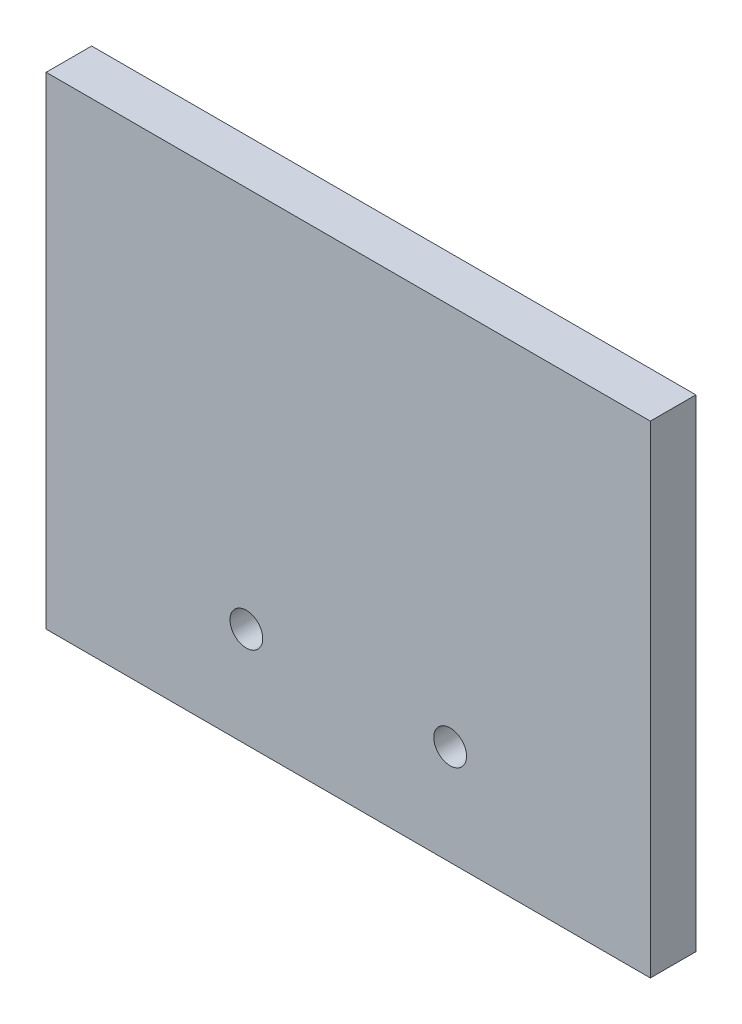
ISO-10303-21;
HEADER;
FILE_DESCRIPTION(('STEP AP214'),'2;1');
FILE_NAME('part.step','',(''),(''),'','','');
FILE_SCHEMA(('AUTOMOTIVE_DESIGN { 1 0 10303 214 1 1 1 1 }'));
ENDSEC;
DATA;
#1=APPLICATION_CONTEXT('core data for automotive mechanical design processes');
#2=APPLICATION_PROTOCOL_DEFINITION('international standard','automotive_design',2000,#1);
#3=PRODUCT_CONTEXT('',#1,'mechanical');
#4=PRODUCT('Part','Part','',(#3));
#5=PRODUCT_RELATED_PRODUCT_CATEGORY('part','',(#4));
#6=PRODUCT_DEFINITION_FORMATION('','',#4);
#7=PRODUCT_DEFINITION_CONTEXT('part definition',#1,'design');
#8=PRODUCT_DEFINITION('design','',#6,#7);
#9=PRODUCT_DEFINITION_SHAPE('','',#8);
#10=(LENGTH_UNIT() NAMED_UNIT(*) SI_UNIT(.MILLI.,.METRE.));
#11=(NAMED_UNIT(*) PLANE_ANGLE_UNIT() SI_UNIT($,.RADIAN.));
#12=(NAMED_UNIT(*) SI_UNIT($,.STERADIAN.) SOLID_ANGLE_UNIT());
#13=UNCERTAINTY_MEASURE_WITH_UNIT(LENGTH_MEASURE(1.E-05),#10,'distance_accuracy_value','');
#14=(GEOMETRIC_REPRESENTATION_CONTEXT(3) GLOBAL_UNCERTAINTY_ASSIGNED_CONTEXT((#13)) GLOBAL_UNIT_ASSIGNED_CONTEXT((#10,
#11,#12)) REPRESENTATION_CONTEXT('',''));
#15=CARTESIAN_POINT('',(0.,0.,0.));
#16=DIRECTION('',(0.,0.,1.));
#17=DIRECTION('',(1.,0.,0.));
#18=AXIS2_PLACEMENT_3D('',#15,#16,#17);
#19=CARTESIAN_POINT('',(-20.2,0.,61.07));
#20=DIRECTION('',(0.,0.,1.));
#21=DIRECTION('',(1.,0.,0.));
#22=AXIS2_PLACEMENT_3D('',#19,#20,#21);
#23=PLANE('',#22);
#24=DIRECTION('',(0.,-1.,0.));
#25=VECTOR('',#24,1.);
#26=CARTESIAN_POINT('',(58.2,0.,61.07));
#27=LINE('',#26,#25);
#28=CARTESIAN_POINT('',(58.2,53.,61.07));
#29=VERTEX_POINT('',#28);
#30=CARTESIAN_POINT('',(58.2,0.,61.07));
#31=VERTEX_POINT('',#30);
#32=EDGE_CURVE('E62',#29,#31,#27,.T.);
#33=ORIENTED_EDGE('',*,*,#32,.F.);
#34=DIRECTION('',(1.,0.,0.));
#35=VECTOR('',#34,1.);
#36=CARTESIAN_POINT('',(-8.2,53.,61.07));
#37=LINE('',#36,#35);
#38=CARTESIAN_POINT('',(-8.2,53.,61.07));
#39=VERTEX_POINT('',#38);
#40=EDGE_CURVE('E87',#39,#29,#37,.T.);
#41=ORIENTED_EDGE('',*,*,#40,.F.);
#42=DIRECTION('',(0.,1.,0.));
#43=VECTOR('',#42,1.);
#44=CARTESIAN_POINT('',(-8.2,0.,61.07));
#45=LINE('',#44,#43);
#46=CARTESIAN_POINT('',(-8.2,0.,61.07));
#47=VERTEX_POINT('',#46);
#48=EDGE_CURVE('E83',#47,#39,#45,.T.);
#49=ORIENTED_EDGE('',*,*,#48,.F.);
#50=DIRECTION('',(1.,0.,0.));
#51=VECTOR('',#50,1.);
#52=CARTESIAN_POINT('',(-20.2,0.,61.07));
#53=LINE('',#52,#51);
#54=EDGE_CURVE('E11',#47,#31,#53,.T.);
#55=ORIENTED_EDGE('',*,*,#54,.T.);
#56=EDGE_LOOP('',(#33,#41,#49,#55));
#57=FACE_BOUND('',#56,.T.);
#58=CARTESIAN_POINT('',(36.2,11.,61.07));
#59=DIRECTION('',(0.,0.,1.));
#60=DIRECTION('',(1.,0.,0.));
#61=AXIS2_PLACEMENT_3D('',#58,#59,#60);
#62=CIRCLE('',#61,1.8);
#63=CARTESIAN_POINT('',(38.,11.,61.07));
#64=VERTEX_POINT('',#63);
#65=EDGE_CURVE('E119',#64,#64,#62,.T.);
#66=ORIENTED_EDGE('',*,*,#65,.F.);
#67=EDGE_LOOP('',(#66));
#68=FACE_BOUND('',#67,.T.);
#69=CARTESIAN_POINT('',(13.8,11.,61.07));
#70=DIRECTION('',(0.,0.,1.));
#71=DIRECTION('',(1.,0.,0.));
#72=AXIS2_PLACEMENT_3D('',#69,#70,#71);
#73=CIRCLE('',#72,1.8);
#74=CARTESIAN_POINT('',(15.6,11.,61.07));
#75=VERTEX_POINT('',#74);
#76=EDGE_CURVE('E47',#75,#75,#73,.T.);
#77=ORIENTED_EDGE('',*,*,#76,.F.);
#78=EDGE_LOOP('',(#77));
#79=FACE_BOUND('',#78,.T.);
#80=ADVANCED_FACE('F39',(#57,#68,#79),#23,.T.);
#81=CARTESIAN_POINT('',(0.,0.,0.));
#82=DIRECTION('',(0.,-1.,0.));
#83=DIRECTION('',(0.,0.,-1.));
#84=AXIS2_PLACEMENT_3D('',#81,#82,#83);
#85=PLANE('',#84);
#86=DIRECTION('',(0.,0.,-1.));
#87=VECTOR('',#86,1.);
#88=CARTESIAN_POINT('',(58.2,0.,0.));
#89=LINE('',#88,#87);
#90=CARTESIAN_POINT('',(58.2,0.,56.07));
#91=VERTEX_POINT('',#90);
#92=EDGE_CURVE('E114',#31,#91,#89,.T.);
#93=ORIENTED_EDGE('',*,*,#92,.F.);
#94=ORIENTED_EDGE('',*,*,#54,.F.);
#95=DIRECTION('',(0.,0.,1.));
#96=VECTOR('',#95,1.);
#97=CARTESIAN_POINT('',(-8.2,0.,0.));
#98=LINE('',#97,#96);
#99=CARTESIAN_POINT('',(-8.2,0.,56.07));
#100=VERTEX_POINT('',#99);
#101=EDGE_CURVE('E54',#100,#47,#98,.T.);
#102=ORIENTED_EDGE('',*,*,#101,.F.);
#103=DIRECTION('',(-1.,0.,0.));
#104=VECTOR('',#103,1.);
#105=CARTESIAN_POINT('',(-8.2,0.,56.07));
#106=LINE('',#105,#104);
#107=EDGE_CURVE('E88',#91,#100,#106,.T.);
#108=ORIENTED_EDGE('',*,*,#107,.F.);
#109=EDGE_LOOP('',(#93,#94,#102,#108));
#110=FACE_BOUND('',#109,.T.);
#111=ADVANCED_FACE('F41',(#110),#85,.T.);
#112=CARTESIAN_POINT('',(13.8,11.,62.07));
#113=DIRECTION('',(0.,0.,-1.));
#114=DIRECTION('',(-1.,0.,0.));
#115=AXIS2_PLACEMENT_3D('',#112,#113,#114);
#116=CYLINDRICAL_SURFACE('',#115,1.8);
#117=ORIENTED_EDGE('',*,*,#76,.T.);
#118=EDGE_LOOP('',(#117));
#119=FACE_BOUND('',#118,.T.);
#120=CARTESIAN_POINT('',(13.8,11.,56.07));
#121=DIRECTION('',(0.,0.,-1.));
#122=DIRECTION('',(-1.,0.,0.));
#123=AXIS2_PLACEMENT_3D('',#120,#121,#122);
#124=CIRCLE('',#123,1.8);
#125=CARTESIAN_POINT('',(12.,11.,56.07));
#126=VERTEX_POINT('',#125);
#127=EDGE_CURVE('E103',#126,#126,#124,.T.);
#128=ORIENTED_EDGE('',*,*,#127,.T.);
#129=EDGE_LOOP('',(#128));
#130=FACE_BOUND('',#129,.T.);
#131=ADVANCED_FACE('F124',(#119,#130),#116,.F.);
#132=CARTESIAN_POINT('',(36.2,11.,62.07));
#133=DIRECTION('',(0.,0.,-1.));
#134=DIRECTION('',(-1.,0.,0.));
#135=AXIS2_PLACEMENT_3D('',#132,#133,#134);
#136=CYLINDRICAL_SURFACE('',#135,1.8);
#137=ORIENTED_EDGE('',*,*,#65,.T.);
#138=EDGE_LOOP('',(#137));
#139=FACE_BOUND('',#138,.T.);
#140=CARTESIAN_POINT('',(36.2,11.,56.07));
#141=DIRECTION('',(0.,0.,-1.));
#142=DIRECTION('',(-1.,0.,0.));
#143=AXIS2_PLACEMENT_3D('',#140,#141,#142);
#144=CIRCLE('',#143,1.8);
#145=CARTESIAN_POINT('',(34.4,11.,56.07));
#146=VERTEX_POINT('',#145);
#147=EDGE_CURVE('E106',#146,#146,#144,.T.);
#148=ORIENTED_EDGE('',*,*,#147,.T.);
#149=EDGE_LOOP('',(#148));
#150=FACE_BOUND('',#149,.T.);
#151=ADVANCED_FACE('F137',(#139,#150),#136,.F.);
#152=CARTESIAN_POINT('',(-8.2,22.,149.07));
#153=DIRECTION('',(1.,0.,0.));
#154=DIRECTION('',(0.,1.,0.));
#155=AXIS2_PLACEMENT_3D('',#152,#153,#154);
#156=PLANE('',#155);
#157=ORIENTED_EDGE('',*,*,#48,.T.);
#158=DIRECTION('',(0.,0.,1.));
#159=VECTOR('',#158,1.);
#160=CARTESIAN_POINT('',(-8.2,53.,59.07));
#161=LINE('',#160,#159);
#162=CARTESIAN_POINT('',(-8.2,53.,56.07));
#163=VERTEX_POINT('',#162);
#164=EDGE_CURVE('E78',#163,#39,#161,.T.);
#165=ORIENTED_EDGE('',*,*,#164,.F.);
#166=DIRECTION('',(0.,1.,0.));
#167=VECTOR('',#166,1.);
#168=CARTESIAN_POINT('',(-8.2,0.,56.07));
#169=LINE('',#168,#167);
#170=EDGE_CURVE('E82',#100,#163,#169,.T.);
#171=ORIENTED_EDGE('',*,*,#170,.F.);
#172=ORIENTED_EDGE('',*,*,#101,.T.);
#173=EDGE_LOOP('',(#157,#165,#171,#172));
#174=FACE_BOUND('',#173,.T.);
#175=ADVANCED_FACE('F80',(#174),#156,.F.);
#176=CARTESIAN_POINT('',(58.2,22.,149.07));
#177=DIRECTION('',(-1.,0.,0.));
#178=DIRECTION('',(0.,0.,1.));
#179=AXIS2_PLACEMENT_3D('',#176,#177,#178);
#180=PLANE('',#179);
#181=ORIENTED_EDGE('',*,*,#32,.T.);
#182=ORIENTED_EDGE('',*,*,#92,.T.);
#183=DIRECTION('',(0.,-1.,0.));
#184=VECTOR('',#183,1.);
#185=CARTESIAN_POINT('',(58.2,0.,56.07));
#186=LINE('',#185,#184);
#187=CARTESIAN_POINT('',(58.2,53.,56.07));
#188=VERTEX_POINT('',#187);
#189=EDGE_CURVE('E97',#188,#91,#186,.T.);
#190=ORIENTED_EDGE('',*,*,#189,.F.);
#191=DIRECTION('',(0.,0.,-1.));
#192=VECTOR('',#191,1.);
#193=CARTESIAN_POINT('',(58.2,53.,59.07));
#194=LINE('',#193,#192);
#195=EDGE_CURVE('E93',#29,#188,#194,.T.);
#196=ORIENTED_EDGE('',*,*,#195,.F.);
#197=EDGE_LOOP('',(#181,#182,#190,#196));
#198=FACE_BOUND('',#197,.T.);
#199=ADVANCED_FACE('F143',(#198),#180,.F.);
#200=CARTESIAN_POINT('',(0.,53.,0.));
#201=DIRECTION('',(0.,1.,0.));
#202=DIRECTION('',(0.,0.,1.));
#203=AXIS2_PLACEMENT_3D('',#200,#201,#202);
#204=PLANE('',#203);
#205=ORIENTED_EDGE('',*,*,#164,.T.);
#206=ORIENTED_EDGE('',*,*,#40,.T.);
#207=ORIENTED_EDGE('',*,*,#195,.T.);
#208=DIRECTION('',(1.,0.,0.));
#209=VECTOR('',#208,1.);
#210=CARTESIAN_POINT('',(-8.2,53.,56.07));
#211=LINE('',#210,#209);
#212=EDGE_CURVE('E91',#163,#188,#211,.T.);
#213=ORIENTED_EDGE('',*,*,#212,.F.);
#214=EDGE_LOOP('',(#205,#206,#207,#213));
#215=FACE_BOUND('',#214,.T.);
#216=ADVANCED_FACE('F92',(#215),#204,.T.);
#217=CARTESIAN_POINT('',(0.,0.,56.07));
#218=DIRECTION('',(0.,0.,-1.));
#219=DIRECTION('',(-1.,0.,0.));
#220=AXIS2_PLACEMENT_3D('',#217,#218,#219);
#221=PLANE('',#220);
#222=ORIENTED_EDGE('',*,*,#127,.F.);
#223=EDGE_LOOP('',(#222));
#224=FACE_BOUND('',#223,.T.);
#225=ORIENTED_EDGE('',*,*,#170,.T.);
#226=ORIENTED_EDGE('',*,*,#212,.T.);
#227=ORIENTED_EDGE('',*,*,#189,.T.);
#228=ORIENTED_EDGE('',*,*,#107,.T.);
#229=EDGE_LOOP('',(#225,#226,#227,#228));
#230=FACE_BOUND('',#229,.T.);
#231=ORIENTED_EDGE('',*,*,#147,.F.);
#232=EDGE_LOOP('',(#231));
#233=FACE_BOUND('',#232,.T.);
#234=ADVANCED_FACE('F100',(#224,#230,#233),#221,.T.);
#235=CLOSED_SHELL('',(#80,#111,#131,#151,#175,#199,#216,#234));
#236=MANIFOLD_SOLID_BREP('B2',#235);
#237=ADVANCED_BREP_SHAPE_REPRESENTATION('',(#18,#236),#14);
#238=SHAPE_DEFINITION_REPRESENTATION(#9,#237);
ENDSEC;
END-ISO-10303-21;
